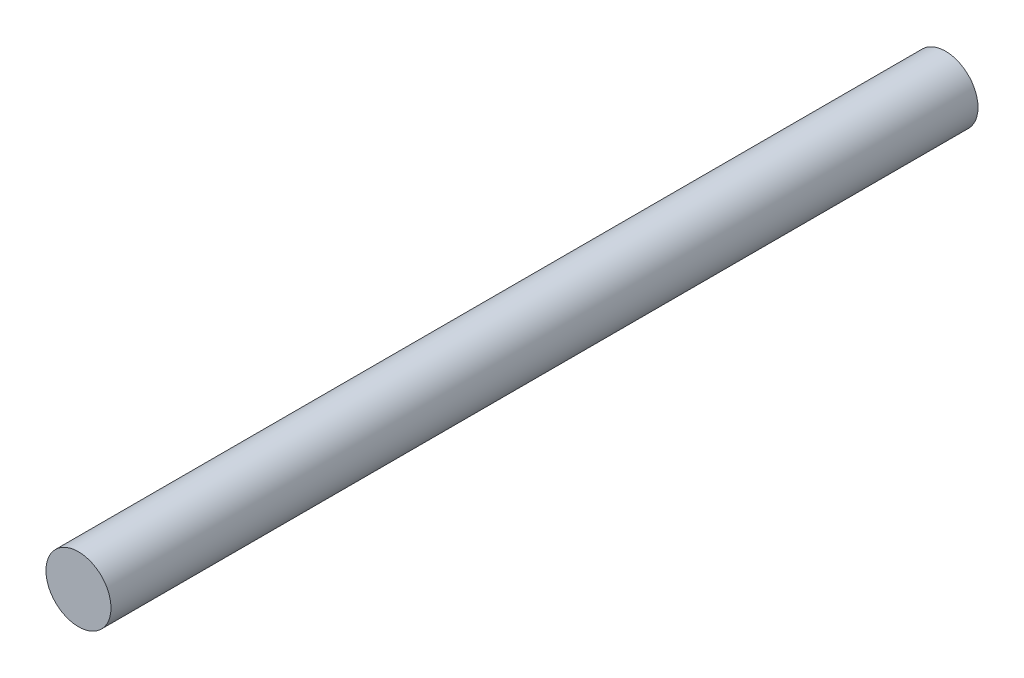
ISO-10303-21;
HEADER;
FILE_DESCRIPTION(('STEP AP214'),'2;1');
FILE_NAME('part.step','',(''),(''),'','','');
FILE_SCHEMA(('AUTOMOTIVE_DESIGN { 1 0 10303 214 1 1 1 1 }'));
ENDSEC;
DATA;
#1=APPLICATION_CONTEXT('core data for automotive mechanical design processes');
#2=APPLICATION_PROTOCOL_DEFINITION('international standard','automotive_design',2000,#1);
#3=PRODUCT_CONTEXT('',#1,'mechanical');
#4=PRODUCT('Part','Part','',(#3));
#5=PRODUCT_RELATED_PRODUCT_CATEGORY('part','',(#4));
#6=PRODUCT_DEFINITION_FORMATION('','',#4);
#7=PRODUCT_DEFINITION_CONTEXT('part definition',#1,'design');
#8=PRODUCT_DEFINITION('design','',#6,#7);
#9=PRODUCT_DEFINITION_SHAPE('','',#8);
#10=(LENGTH_UNIT() NAMED_UNIT(*) SI_UNIT(.MILLI.,.METRE.));
#11=(NAMED_UNIT(*) PLANE_ANGLE_UNIT() SI_UNIT($,.RADIAN.));
#12=(NAMED_UNIT(*) SI_UNIT($,.STERADIAN.) SOLID_ANGLE_UNIT());
#13=UNCERTAINTY_MEASURE_WITH_UNIT(LENGTH_MEASURE(1.E-05),#10,'distance_accuracy_value','');
#14=(GEOMETRIC_REPRESENTATION_CONTEXT(3) GLOBAL_UNCERTAINTY_ASSIGNED_CONTEXT((#13)) GLOBAL_UNIT_ASSIGNED_CONTEXT((#10,
#11,#12)) REPRESENTATION_CONTEXT('',''));
#15=CARTESIAN_POINT('',(0.,0.,0.));
#16=DIRECTION('',(0.,0.,1.));
#17=DIRECTION('',(1.,0.,0.));
#18=AXIS2_PLACEMENT_3D('',#15,#16,#17);
#19=CARTESIAN_POINT('',(0.,0.,40.));
#20=DIRECTION('',(0.,0.,-1.));
#21=DIRECTION('',(-1.,0.,0.));
#22=AXIS2_PLACEMENT_3D('',#19,#20,#21);
#23=CYLINDRICAL_SURFACE('',#22,1.5);
#24=CARTESIAN_POINT('',(0.,0.,40.));
#25=DIRECTION('',(0.,0.,1.));
#26=DIRECTION('',(1.,0.,0.));
#27=AXIS2_PLACEMENT_3D('',#24,#25,#26);
#28=CIRCLE('',#27,1.5);
#29=CARTESIAN_POINT('',(1.5,0.,40.));
#30=VERTEX_POINT('',#29);
#31=EDGE_CURVE('E10',#30,#30,#28,.T.);
#32=ORIENTED_EDGE('',*,*,#31,.F.);
#33=EDGE_LOOP('',(#32));
#34=FACE_BOUND('',#33,.T.);
#35=CARTESIAN_POINT('',(0.,0.,0.));
#36=DIRECTION('',(0.,0.,1.));
#37=DIRECTION('',(1.,0.,0.));
#38=AXIS2_PLACEMENT_3D('',#35,#36,#37);
#39=CIRCLE('',#38,1.5);
#40=CARTESIAN_POINT('',(1.5,0.,0.));
#41=VERTEX_POINT('',#40);
#42=EDGE_CURVE('E37',#41,#41,#39,.T.);
#43=ORIENTED_EDGE('',*,*,#42,.T.);
#44=EDGE_LOOP('',(#43));
#45=FACE_BOUND('',#44,.T.);
#46=ADVANCED_FACE('F34',(#34,#45),#23,.T.);
#47=CARTESIAN_POINT('',(0.,0.,40.));
#48=DIRECTION('',(0.,0.,1.));
#49=DIRECTION('',(1.,0.,0.));
#50=AXIS2_PLACEMENT_3D('',#47,#48,#49);
#51=PLANE('',#50);
#52=ORIENTED_EDGE('',*,*,#31,.T.);
#53=EDGE_LOOP('',(#52));
#54=FACE_BOUND('',#53,.T.);
#55=ADVANCED_FACE('F49',(#54),#51,.T.);
#56=CARTESIAN_POINT('',(0.,0.,0.));
#57=DIRECTION('',(0.,0.,1.));
#58=DIRECTION('',(1.,0.,0.));
#59=AXIS2_PLACEMENT_3D('',#56,#57,#58);
#60=PLANE('',#59);
#61=ORIENTED_EDGE('',*,*,#42,.F.);
#62=EDGE_LOOP('',(#61));
#63=FACE_BOUND('',#62,.T.);
#64=ADVANCED_FACE('F47',(#63),#60,.F.);
#65=CLOSED_SHELL('',(#46,#55,#64));
#66=MANIFOLD_SOLID_BREP('B2',#65);
#67=ADVANCED_BREP_SHAPE_REPRESENTATION('',(#18,#66),#14);
#68=SHAPE_DEFINITION_REPRESENTATION(#9,#67);
ENDSEC;
END-ISO-10303-21;
